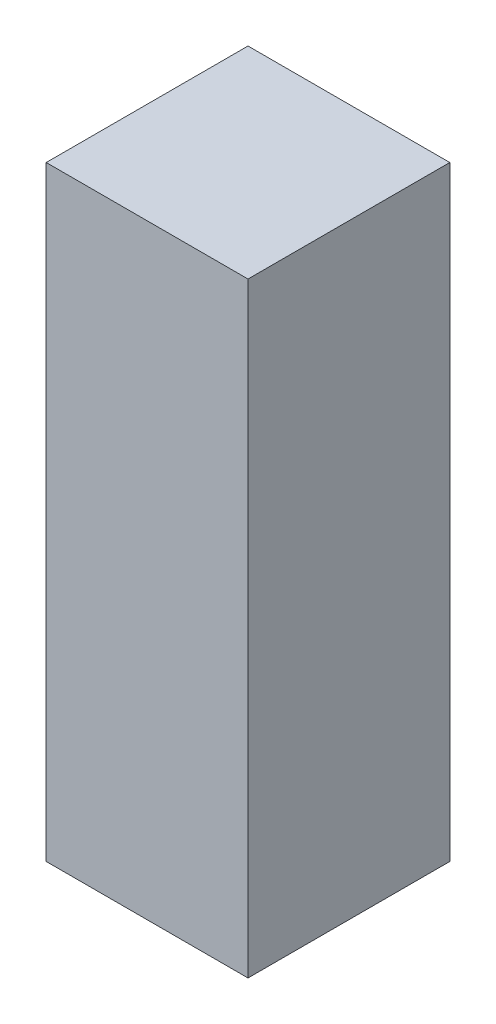
ISO-10303-21;
HEADER;
FILE_DESCRIPTION(('STEP AP214'),'2;1');
FILE_NAME('part.step','',(''),(''),'','','');
FILE_SCHEMA(('AUTOMOTIVE_DESIGN { 1 0 10303 214 1 1 1 1 }'));
ENDSEC;
DATA;
#1=APPLICATION_CONTEXT('core data for automotive mechanical design processes');
#2=APPLICATION_PROTOCOL_DEFINITION('international standard','automotive_design',2000,#1);
#3=PRODUCT_CONTEXT('',#1,'mechanical');
#4=PRODUCT('Part','Part','',(#3));
#5=PRODUCT_RELATED_PRODUCT_CATEGORY('part','',(#4));
#6=PRODUCT_DEFINITION_FORMATION('','',#4);
#7=PRODUCT_DEFINITION_CONTEXT('part definition',#1,'design');
#8=PRODUCT_DEFINITION('design','',#6,#7);
#9=PRODUCT_DEFINITION_SHAPE('','',#8);
#10=(LENGTH_UNIT() NAMED_UNIT(*) SI_UNIT(.MILLI.,.METRE.));
#11=(NAMED_UNIT(*) PLANE_ANGLE_UNIT() SI_UNIT($,.RADIAN.));
#12=(NAMED_UNIT(*) SI_UNIT($,.STERADIAN.) SOLID_ANGLE_UNIT());
#13=UNCERTAINTY_MEASURE_WITH_UNIT(LENGTH_MEASURE(1.E-05),#10,'distance_accuracy_value','');
#14=(GEOMETRIC_REPRESENTATION_CONTEXT(3) GLOBAL_UNCERTAINTY_ASSIGNED_CONTEXT((#13)) GLOBAL_UNIT_ASSIGNED_CONTEXT((#10,
#11,#12)) REPRESENTATION_CONTEXT('',''));
#15=CARTESIAN_POINT('',(0.,0.,0.));
#16=DIRECTION('',(0.,0.,1.));
#17=DIRECTION('',(1.,0.,0.));
#18=AXIS2_PLACEMENT_3D('',#15,#16,#17);
#19=CARTESIAN_POINT('',(500.,3000.,-500.));
#20=DIRECTION('',(-1.,0.,0.));
#21=DIRECTION('',(0.,0.,1.));
#22=AXIS2_PLACEMENT_3D('',#19,#20,#21);
#23=PLANE('',#22);
#24=DIRECTION('',(0.,0.,-1.));
#25=VECTOR('',#24,1.);
#26=CARTESIAN_POINT('',(500.,0.,-500.));
#27=LINE('',#26,#25);
#28=CARTESIAN_POINT('',(500.,0.,500.));
#29=VERTEX_POINT('',#28);
#30=CARTESIAN_POINT('',(500.,0.,-500.));
#31=VERTEX_POINT('',#30);
#32=EDGE_CURVE('E107',#29,#31,#27,.T.);
#33=ORIENTED_EDGE('',*,*,#32,.T.);
#34=DIRECTION('',(0.,-1.,0.));
#35=VECTOR('',#34,1.);
#36=CARTESIAN_POINT('',(500.,3000.,-500.));
#37=LINE('',#36,#35);
#38=CARTESIAN_POINT('',(500.,3000.,-500.));
#39=VERTEX_POINT('',#38);
#40=EDGE_CURVE('E11',#39,#31,#37,.T.);
#41=ORIENTED_EDGE('',*,*,#40,.F.);
#42=DIRECTION('',(0.,0.,-1.));
#43=VECTOR('',#42,1.);
#44=CARTESIAN_POINT('',(500.,3000.,-500.));
#45=LINE('',#44,#43);
#46=CARTESIAN_POINT('',(500.,3000.,500.));
#47=VERTEX_POINT('',#46);
#48=EDGE_CURVE('E91',#47,#39,#45,.T.);
#49=ORIENTED_EDGE('',*,*,#48,.F.);
#50=DIRECTION('',(0.,-1.,0.));
#51=VECTOR('',#50,1.);
#52=CARTESIAN_POINT('',(500.,3000.,500.));
#53=LINE('',#52,#51);
#54=EDGE_CURVE('E103',#47,#29,#53,.T.);
#55=ORIENTED_EDGE('',*,*,#54,.T.);
#56=EDGE_LOOP('',(#33,#41,#49,#55));
#57=FACE_BOUND('',#56,.T.);
#58=ADVANCED_FACE('F39',(#57),#23,.F.);
#59=CARTESIAN_POINT('',(-500.,3000.,-500.));
#60=DIRECTION('',(0.,0.,1.));
#61=DIRECTION('',(1.,0.,0.));
#62=AXIS2_PLACEMENT_3D('',#59,#60,#61);
#63=PLANE('',#62);
#64=DIRECTION('',(-1.,0.,0.));
#65=VECTOR('',#64,1.);
#66=CARTESIAN_POINT('',(-500.,0.,-500.));
#67=LINE('',#66,#65);
#68=CARTESIAN_POINT('',(-500.,0.,-500.));
#69=VERTEX_POINT('',#68);
#70=EDGE_CURVE('E96',#31,#69,#67,.T.);
#71=ORIENTED_EDGE('',*,*,#70,.T.);
#72=DIRECTION('',(0.,-1.,0.));
#73=VECTOR('',#72,1.);
#74=CARTESIAN_POINT('',(-500.,3000.,-500.));
#75=LINE('',#74,#73);
#76=CARTESIAN_POINT('',(-500.,3000.,-500.));
#77=VERTEX_POINT('',#76);
#78=EDGE_CURVE('E48',#77,#69,#75,.T.);
#79=ORIENTED_EDGE('',*,*,#78,.F.);
#80=DIRECTION('',(-1.,0.,0.));
#81=VECTOR('',#80,1.);
#82=CARTESIAN_POINT('',(-500.,3000.,-500.));
#83=LINE('',#82,#81);
#84=EDGE_CURVE('E86',#39,#77,#83,.T.);
#85=ORIENTED_EDGE('',*,*,#84,.F.);
#86=ORIENTED_EDGE('',*,*,#40,.T.);
#87=EDGE_LOOP('',(#71,#79,#85,#86));
#88=FACE_BOUND('',#87,.T.);
#89=ADVANCED_FACE('F95',(#88),#63,.F.);
#90=CARTESIAN_POINT('',(-500.,3000.,-500.));
#91=DIRECTION('',(1.,0.,0.));
#92=DIRECTION('',(0.,0.,-1.));
#93=AXIS2_PLACEMENT_3D('',#90,#91,#92);
#94=PLANE('',#93);
#95=DIRECTION('',(0.,0.,1.));
#96=VECTOR('',#95,1.);
#97=CARTESIAN_POINT('',(-500.,0.,-500.));
#98=LINE('',#97,#96);
#99=CARTESIAN_POINT('',(-500.,0.,500.));
#100=VERTEX_POINT('',#99);
#101=EDGE_CURVE('E73',#69,#100,#98,.T.);
#102=ORIENTED_EDGE('',*,*,#101,.T.);
#103=DIRECTION('',(0.,-1.,0.));
#104=VECTOR('',#103,1.);
#105=CARTESIAN_POINT('',(-500.,3000.,500.));
#106=LINE('',#105,#104);
#107=CARTESIAN_POINT('',(-500.,3000.,500.));
#108=VERTEX_POINT('',#107);
#109=EDGE_CURVE('E98',#108,#100,#106,.T.);
#110=ORIENTED_EDGE('',*,*,#109,.F.);
#111=DIRECTION('',(0.,0.,1.));
#112=VECTOR('',#111,1.);
#113=CARTESIAN_POINT('',(-500.,3000.,-500.));
#114=LINE('',#113,#112);
#115=EDGE_CURVE('E89',#77,#108,#114,.T.);
#116=ORIENTED_EDGE('',*,*,#115,.F.);
#117=ORIENTED_EDGE('',*,*,#78,.T.);
#118=EDGE_LOOP('',(#102,#110,#116,#117));
#119=FACE_BOUND('',#118,.T.);
#120=ADVANCED_FACE('F99',(#119),#94,.F.);
#121=CARTESIAN_POINT('',(-500.,3000.,500.));
#122=DIRECTION('',(0.,0.,-1.));
#123=DIRECTION('',(-1.,0.,0.));
#124=AXIS2_PLACEMENT_3D('',#121,#122,#123);
#125=PLANE('',#124);
#126=DIRECTION('',(1.,0.,0.));
#127=VECTOR('',#126,1.);
#128=CARTESIAN_POINT('',(-500.,0.,500.));
#129=LINE('',#128,#127);
#130=EDGE_CURVE('E79',#100,#29,#129,.T.);
#131=ORIENTED_EDGE('',*,*,#130,.T.);
#132=ORIENTED_EDGE('',*,*,#54,.F.);
#133=DIRECTION('',(1.,0.,0.));
#134=VECTOR('',#133,1.);
#135=CARTESIAN_POINT('',(-500.,3000.,500.));
#136=LINE('',#135,#134);
#137=EDGE_CURVE('E56',#108,#47,#136,.T.);
#138=ORIENTED_EDGE('',*,*,#137,.F.);
#139=ORIENTED_EDGE('',*,*,#109,.T.);
#140=EDGE_LOOP('',(#131,#132,#138,#139));
#141=FACE_BOUND('',#140,.T.);
#142=ADVANCED_FACE('F120',(#141),#125,.F.);
#143=CARTESIAN_POINT('',(0.,3000.,0.));
#144=DIRECTION('',(0.,1.,0.));
#145=DIRECTION('',(0.,0.,1.));
#146=AXIS2_PLACEMENT_3D('',#143,#144,#145);
#147=PLANE('',#146);
#148=ORIENTED_EDGE('',*,*,#48,.T.);
#149=ORIENTED_EDGE('',*,*,#84,.T.);
#150=ORIENTED_EDGE('',*,*,#115,.T.);
#151=ORIENTED_EDGE('',*,*,#137,.T.);
#152=EDGE_LOOP('',(#148,#149,#150,#151));
#153=FACE_BOUND('',#152,.T.);
#154=ADVANCED_FACE('F87',(#153),#147,.T.);
#155=CARTESIAN_POINT('',(0.,0.,0.));
#156=DIRECTION('',(0.,1.,0.));
#157=DIRECTION('',(0.,0.,1.));
#158=AXIS2_PLACEMENT_3D('',#155,#156,#157);
#159=PLANE('',#158);
#160=ORIENTED_EDGE('',*,*,#32,.F.);
#161=ORIENTED_EDGE('',*,*,#130,.F.);
#162=ORIENTED_EDGE('',*,*,#101,.F.);
#163=ORIENTED_EDGE('',*,*,#70,.F.);
#164=EDGE_LOOP('',(#160,#161,#162,#163));
#165=FACE_BOUND('',#164,.T.);
#166=ADVANCED_FACE('F123',(#165),#159,.F.);
#167=CLOSED_SHELL('',(#58,#89,#120,#142,#154,#166));
#168=MANIFOLD_SOLID_BREP('B2',#167);
#169=ADVANCED_BREP_SHAPE_REPRESENTATION('',(#18,#168),#14);
#170=SHAPE_DEFINITION_REPRESENTATION(#9,#169);
ENDSEC;
END-ISO-10303-21;
